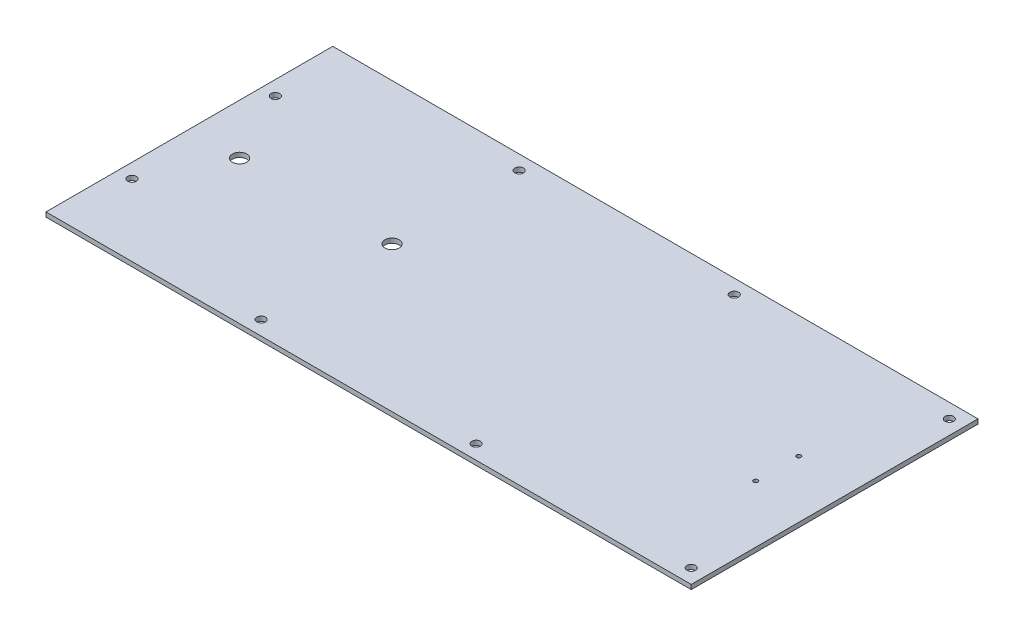
ISO-10303-21;
HEADER;
FILE_DESCRIPTION(('STEP AP214'),'2;1');
FILE_NAME('part.step','',(''),(''),'','','');
FILE_SCHEMA(('AUTOMOTIVE_DESIGN { 1 0 10303 214 1 1 1 1 }'));
ENDSEC;
DATA;
#1=APPLICATION_CONTEXT('core data for automotive mechanical design processes');
#2=APPLICATION_PROTOCOL_DEFINITION('international standard','automotive_design',2000,#1);
#3=PRODUCT_CONTEXT('',#1,'mechanical');
#4=PRODUCT('Part','Part','',(#3));
#5=PRODUCT_RELATED_PRODUCT_CATEGORY('part','',(#4));
#6=PRODUCT_DEFINITION_FORMATION('','',#4);
#7=PRODUCT_DEFINITION_CONTEXT('part definition',#1,'design');
#8=PRODUCT_DEFINITION('design','',#6,#7);
#9=PRODUCT_DEFINITION_SHAPE('','',#8);
#10=(LENGTH_UNIT() NAMED_UNIT(*) SI_UNIT(.MILLI.,.METRE.));
#11=(NAMED_UNIT(*) PLANE_ANGLE_UNIT() SI_UNIT($,.RADIAN.));
#12=(NAMED_UNIT(*) SI_UNIT($,.STERADIAN.) SOLID_ANGLE_UNIT());
#13=UNCERTAINTY_MEASURE_WITH_UNIT(LENGTH_MEASURE(1.E-05),#10,'distance_accuracy_value','');
#14=(GEOMETRIC_REPRESENTATION_CONTEXT(3) GLOBAL_UNCERTAINTY_ASSIGNED_CONTEXT((#13)) GLOBAL_UNIT_ASSIGNED_CONTEXT((#10,
#11,#12)) REPRESENTATION_CONTEXT('',''));
#15=CARTESIAN_POINT('',(0.,0.,0.));
#16=DIRECTION('',(0.,0.,1.));
#17=DIRECTION('',(1.,0.,0.));
#18=AXIS2_PLACEMENT_3D('',#15,#16,#17);
#19=CARTESIAN_POINT('',(0.,3.175,0.));
#20=DIRECTION('',(0.,-1.,0.));
#21=DIRECTION('',(0.,0.,-1.));
#22=AXIS2_PLACEMENT_3D('',#19,#20,#21);
#23=PLANE('',#22);
#24=DIRECTION('',(0.,0.,-1.));
#25=VECTOR('',#24,1.);
#26=CARTESIAN_POINT('',(450.,3.175,-110.468098834596));
#27=LINE('',#26,#25);
#28=CARTESIAN_POINT('',(450.,3.175,-110.468098834596));
#29=VERTEX_POINT('',#28);
#30=CARTESIAN_POINT('',(450.,3.175,-310.468098834596));
#31=VERTEX_POINT('',#30);
#32=EDGE_CURVE('E95',#29,#31,#27,.T.);
#33=ORIENTED_EDGE('',*,*,#32,.T.);
#34=DIRECTION('',(-1.,0.,0.));
#35=VECTOR('',#34,1.);
#36=CARTESIAN_POINT('',(70.,3.175,-310.468098834596));
#37=LINE('',#36,#35);
#38=CARTESIAN_POINT('',(0.,3.175,-310.468098834596));
#39=VERTEX_POINT('',#38);
#40=EDGE_CURVE('E89',#31,#39,#37,.T.);
#41=ORIENTED_EDGE('',*,*,#40,.T.);
#42=DIRECTION('',(0.,0.,1.));
#43=VECTOR('',#42,1.);
#44=CARTESIAN_POINT('',(0.,3.175,-310.468098834596));
#45=LINE('',#44,#43);
#46=CARTESIAN_POINT('',(0.,3.175,-110.468098834596));
#47=VERTEX_POINT('',#46);
#48=EDGE_CURVE('E92',#39,#47,#45,.T.);
#49=ORIENTED_EDGE('',*,*,#48,.T.);
#50=DIRECTION('',(1.,0.,0.));
#51=VECTOR('',#50,1.);
#52=CARTESIAN_POINT('',(70.,3.175,-110.468098834596));
#53=LINE('',#52,#51);
#54=EDGE_CURVE('E61',#47,#29,#53,.T.);
#55=ORIENTED_EDGE('',*,*,#54,.T.);
#56=EDGE_LOOP('',(#33,#41,#49,#55));
#57=FACE_BOUND('',#56,.T.);
#58=CARTESIAN_POINT('',(35.,3.175,-210.468098834596));
#59=DIRECTION('',(0.,1.,0.));
#60=DIRECTION('',(0.,0.,1.));
#61=AXIS2_PLACEMENT_3D('',#58,#59,#60);
#62=CIRCLE('',#61,5.00000000000001);
#63=CARTESIAN_POINT('',(35.,3.175,-205.468098834596));
#64=VERTEX_POINT('',#63);
#65=EDGE_CURVE('E117',#64,#64,#62,.T.);
#66=ORIENTED_EDGE('',*,*,#65,.F.);
#67=EDGE_LOOP('',(#66));
#68=FACE_BOUND('',#67,.T.);
#69=CARTESIAN_POINT('',(140.,3.175,-211.808399399269));
#70=DIRECTION('',(0.,1.,0.));
#71=DIRECTION('',(0.,0.,1.));
#72=AXIS2_PLACEMENT_3D('',#69,#70,#71);
#73=CIRCLE('',#72,4.99999999999999);
#74=CARTESIAN_POINT('',(140.,3.175,-206.808399399269));
#75=VERTEX_POINT('',#74);
#76=EDGE_CURVE('E136',#75,#75,#73,.T.);
#77=ORIENTED_EDGE('',*,*,#76,.F.);
#78=EDGE_LOOP('',(#77));
#79=FACE_BOUND('',#78,.T.);
#80=CARTESIAN_POINT('',(410.,3.175,-225.468098834596));
#81=DIRECTION('',(0.,1.,0.));
#82=DIRECTION('',(0.,0.,1.));
#83=AXIS2_PLACEMENT_3D('',#80,#81,#82);
#84=CIRCLE('',#83,1.50000000000002);
#85=CARTESIAN_POINT('',(410.,3.175,-223.968098834596));
#86=VERTEX_POINT('',#85);
#87=EDGE_CURVE('E144',#86,#86,#84,.T.);
#88=ORIENTED_EDGE('',*,*,#87,.F.);
#89=EDGE_LOOP('',(#88));
#90=FACE_BOUND('',#89,.T.);
#91=CARTESIAN_POINT('',(410.,3.175,-195.468098834596));
#92=DIRECTION('',(0.,1.,0.));
#93=DIRECTION('',(0.,0.,1.));
#94=AXIS2_PLACEMENT_3D('',#91,#92,#93);
#95=CIRCLE('',#94,1.50000000000002);
#96=CARTESIAN_POINT('',(410.,3.175,-193.968098834596));
#97=VERTEX_POINT('',#96);
#98=EDGE_CURVE('E152',#97,#97,#95,.T.);
#99=ORIENTED_EDGE('',*,*,#98,.F.);
#100=EDGE_LOOP('',(#99));
#101=FACE_BOUND('',#100,.T.);
#102=CARTESIAN_POINT('',(10.,3.175,-260.468098834596));
#103=DIRECTION('',(0.,1.,0.));
#104=DIRECTION('',(0.,0.,1.));
#105=AXIS2_PLACEMENT_3D('',#102,#103,#104);
#106=CIRCLE('',#105,3.);
#107=CARTESIAN_POINT('',(10.,3.175,-257.468098834596));
#108=VERTEX_POINT('',#107);
#109=EDGE_CURVE('E160',#108,#108,#106,.T.);
#110=ORIENTED_EDGE('',*,*,#109,.F.);
#111=EDGE_LOOP('',(#110));
#112=FACE_BOUND('',#111,.T.);
#113=CARTESIAN_POINT('',(440.,3.175,-300.468098834596));
#114=DIRECTION('',(0.,1.,0.));
#115=DIRECTION('',(0.,0.,1.));
#116=AXIS2_PLACEMENT_3D('',#113,#114,#115);
#117=CIRCLE('',#116,2.99999999999999);
#118=CARTESIAN_POINT('',(440.,3.175,-297.468098834596));
#119=VERTEX_POINT('',#118);
#120=EDGE_CURVE('E168',#119,#119,#117,.T.);
#121=ORIENTED_EDGE('',*,*,#120,.F.);
#122=EDGE_LOOP('',(#121));
#123=FACE_BOUND('',#122,.T.);
#124=CARTESIAN_POINT('',(140.,3.175,-300.468098834596));
#125=DIRECTION('',(0.,1.,0.));
#126=DIRECTION('',(0.,0.,1.));
#127=AXIS2_PLACEMENT_3D('',#124,#125,#126);
#128=CIRCLE('',#127,2.99999999999999);
#129=CARTESIAN_POINT('',(140.,3.175,-297.468098834596));
#130=VERTEX_POINT('',#129);
#131=EDGE_CURVE('E176',#130,#130,#128,.T.);
#132=ORIENTED_EDGE('',*,*,#131,.F.);
#133=EDGE_LOOP('',(#132));
#134=FACE_BOUND('',#133,.T.);
#135=CARTESIAN_POINT('',(290.,3.175,-300.468098834596));
#136=DIRECTION('',(0.,1.,0.));
#137=DIRECTION('',(0.,0.,1.));
#138=AXIS2_PLACEMENT_3D('',#135,#136,#137);
#139=CIRCLE('',#138,2.99999999999999);
#140=CARTESIAN_POINT('',(290.,3.175,-297.468098834596));
#141=VERTEX_POINT('',#140);
#142=EDGE_CURVE('E184',#141,#141,#139,.T.);
#143=ORIENTED_EDGE('',*,*,#142,.F.);
#144=EDGE_LOOP('',(#143));
#145=FACE_BOUND('',#144,.T.);
#146=CARTESIAN_POINT('',(440.,3.175,-120.468098834596));
#147=DIRECTION('',(0.,1.,0.));
#148=DIRECTION('',(0.,0.,-1.));
#149=AXIS2_PLACEMENT_3D('',#146,#147,#148);
#150=CIRCLE('',#149,2.99999999999999);
#151=CARTESIAN_POINT('',(440.,3.175,-123.468098834596));
#152=VERTEX_POINT('',#151);
#153=EDGE_CURVE('E192',#152,#152,#150,.T.);
#154=ORIENTED_EDGE('',*,*,#153,.F.);
#155=EDGE_LOOP('',(#154));
#156=FACE_BOUND('',#155,.T.);
#157=CARTESIAN_POINT('',(290.,3.175,-120.468098834596));
#158=DIRECTION('',(0.,1.,0.));
#159=DIRECTION('',(0.,0.,-1.));
#160=AXIS2_PLACEMENT_3D('',#157,#158,#159);
#161=CIRCLE('',#160,2.99999999999999);
#162=CARTESIAN_POINT('',(290.,3.175,-123.468098834596));
#163=VERTEX_POINT('',#162);
#164=EDGE_CURVE('E200',#163,#163,#161,.T.);
#165=ORIENTED_EDGE('',*,*,#164,.F.);
#166=EDGE_LOOP('',(#165));
#167=FACE_BOUND('',#166,.T.);
#168=CARTESIAN_POINT('',(140.,3.175,-120.468098834596));
#169=DIRECTION('',(0.,1.,0.));
#170=DIRECTION('',(0.,0.,-1.));
#171=AXIS2_PLACEMENT_3D('',#168,#169,#170);
#172=CIRCLE('',#171,2.99999999999999);
#173=CARTESIAN_POINT('',(140.,3.175,-123.468098834596));
#174=VERTEX_POINT('',#173);
#175=EDGE_CURVE('E208',#174,#174,#172,.T.);
#176=ORIENTED_EDGE('',*,*,#175,.F.);
#177=EDGE_LOOP('',(#176));
#178=FACE_BOUND('',#177,.T.);
#179=CARTESIAN_POINT('',(10.,3.175,-160.468098834596));
#180=DIRECTION('',(0.,1.,0.));
#181=DIRECTION('',(0.,0.,-1.));
#182=AXIS2_PLACEMENT_3D('',#179,#180,#181);
#183=CIRCLE('',#182,3.);
#184=CARTESIAN_POINT('',(10.,3.175,-163.468098834596));
#185=VERTEX_POINT('',#184);
#186=EDGE_CURVE('E216',#185,#185,#183,.T.);
#187=ORIENTED_EDGE('',*,*,#186,.F.);
#188=EDGE_LOOP('',(#187));
#189=FACE_BOUND('',#188,.T.);
#190=ADVANCED_FACE('F43',(#57,#68,#79,#90,#101,#112,#123,#134,#145,#156,#167,#178,#189),#23,.F.);
#191=CARTESIAN_POINT('',(0.,0.,0.));
#192=DIRECTION('',(0.,-1.,0.));
#193=DIRECTION('',(0.,0.,-1.));
#194=AXIS2_PLACEMENT_3D('',#191,#192,#193);
#195=PLANE('',#194);
#196=CARTESIAN_POINT('',(140.,0.,-120.468098834596));
#197=DIRECTION('',(0.,1.,0.));
#198=DIRECTION('',(0.,0.,-1.));
#199=AXIS2_PLACEMENT_3D('',#196,#197,#198);
#200=CIRCLE('',#199,2.99999999999999);
#201=CARTESIAN_POINT('',(140.,0.,-123.468098834596));
#202=VERTEX_POINT('',#201);
#203=EDGE_CURVE('E212',#202,#202,#200,.T.);
#204=ORIENTED_EDGE('',*,*,#203,.T.);
#205=EDGE_LOOP('',(#204));
#206=FACE_BOUND('',#205,.T.);
#207=CARTESIAN_POINT('',(440.,0.,-120.468098834596));
#208=DIRECTION('',(0.,1.,0.));
#209=DIRECTION('',(0.,0.,-1.));
#210=AXIS2_PLACEMENT_3D('',#207,#208,#209);
#211=CIRCLE('',#210,2.99999999999999);
#212=CARTESIAN_POINT('',(440.,0.,-123.468098834596));
#213=VERTEX_POINT('',#212);
#214=EDGE_CURVE('E196',#213,#213,#211,.T.);
#215=ORIENTED_EDGE('',*,*,#214,.T.);
#216=EDGE_LOOP('',(#215));
#217=FACE_BOUND('',#216,.T.);
#218=CARTESIAN_POINT('',(140.,0.,-300.468098834596));
#219=DIRECTION('',(0.,1.,0.));
#220=DIRECTION('',(0.,0.,1.));
#221=AXIS2_PLACEMENT_3D('',#218,#219,#220);
#222=CIRCLE('',#221,2.99999999999999);
#223=CARTESIAN_POINT('',(140.,0.,-297.468098834596));
#224=VERTEX_POINT('',#223);
#225=EDGE_CURVE('E180',#224,#224,#222,.T.);
#226=ORIENTED_EDGE('',*,*,#225,.T.);
#227=EDGE_LOOP('',(#226));
#228=FACE_BOUND('',#227,.T.);
#229=CARTESIAN_POINT('',(10.,0.,-260.468098834596));
#230=DIRECTION('',(0.,1.,0.));
#231=DIRECTION('',(0.,0.,1.));
#232=AXIS2_PLACEMENT_3D('',#229,#230,#231);
#233=CIRCLE('',#232,3.);
#234=CARTESIAN_POINT('',(10.,0.,-257.468098834596));
#235=VERTEX_POINT('',#234);
#236=EDGE_CURVE('E164',#235,#235,#233,.T.);
#237=ORIENTED_EDGE('',*,*,#236,.T.);
#238=EDGE_LOOP('',(#237));
#239=FACE_BOUND('',#238,.T.);
#240=CARTESIAN_POINT('',(410.,0.,-225.468098834596));
#241=DIRECTION('',(0.,1.,0.));
#242=DIRECTION('',(0.,0.,1.));
#243=AXIS2_PLACEMENT_3D('',#240,#241,#242);
#244=CIRCLE('',#243,1.50000000000002);
#245=CARTESIAN_POINT('',(410.,0.,-223.968098834596));
#246=VERTEX_POINT('',#245);
#247=EDGE_CURVE('E148',#246,#246,#244,.T.);
#248=ORIENTED_EDGE('',*,*,#247,.T.);
#249=EDGE_LOOP('',(#248));
#250=FACE_BOUND('',#249,.T.);
#251=CARTESIAN_POINT('',(35.,0.,-210.468098834596));
#252=DIRECTION('',(0.,1.,0.));
#253=DIRECTION('',(0.,0.,1.));
#254=AXIS2_PLACEMENT_3D('',#251,#252,#253);
#255=CIRCLE('',#254,5.00000000000001);
#256=CARTESIAN_POINT('',(35.,0.,-205.468098834596));
#257=VERTEX_POINT('',#256);
#258=EDGE_CURVE('E132',#257,#257,#255,.T.);
#259=ORIENTED_EDGE('',*,*,#258,.T.);
#260=EDGE_LOOP('',(#259));
#261=FACE_BOUND('',#260,.T.);
#262=DIRECTION('',(0.,0.,-1.));
#263=VECTOR('',#262,1.);
#264=CARTESIAN_POINT('',(450.,0.,-110.468098834596));
#265=LINE('',#264,#263);
#266=CARTESIAN_POINT('',(450.,0.,-110.468098834596));
#267=VERTEX_POINT('',#266);
#268=CARTESIAN_POINT('',(450.,0.,-310.468098834596));
#269=VERTEX_POINT('',#268);
#270=EDGE_CURVE('E113',#267,#269,#265,.T.);
#271=ORIENTED_EDGE('',*,*,#270,.F.);
#272=DIRECTION('',(1.,0.,0.));
#273=VECTOR('',#272,1.);
#274=CARTESIAN_POINT('',(70.,0.,-110.468098834596));
#275=LINE('',#274,#273);
#276=CARTESIAN_POINT('',(0.,0.,-110.468098834596));
#277=VERTEX_POINT('',#276);
#278=EDGE_CURVE('E78',#277,#267,#275,.T.);
#279=ORIENTED_EDGE('',*,*,#278,.F.);
#280=DIRECTION('',(0.,0.,1.));
#281=VECTOR('',#280,1.);
#282=CARTESIAN_POINT('',(0.,0.,-310.468098834596));
#283=LINE('',#282,#281);
#284=CARTESIAN_POINT('',(0.,0.,-310.468098834596));
#285=VERTEX_POINT('',#284);
#286=EDGE_CURVE('E120',#285,#277,#283,.T.);
#287=ORIENTED_EDGE('',*,*,#286,.F.);
#288=DIRECTION('',(-1.,0.,0.));
#289=VECTOR('',#288,1.);
#290=CARTESIAN_POINT('',(0.,0.,-310.468098834596));
#291=LINE('',#290,#289);
#292=EDGE_CURVE('E101',#269,#285,#291,.T.);
#293=ORIENTED_EDGE('',*,*,#292,.F.);
#294=EDGE_LOOP('',(#271,#279,#287,#293));
#295=FACE_BOUND('',#294,.T.);
#296=CARTESIAN_POINT('',(140.,0.,-211.808399399269));
#297=DIRECTION('',(0.,1.,0.));
#298=DIRECTION('',(0.,0.,1.));
#299=AXIS2_PLACEMENT_3D('',#296,#297,#298);
#300=CIRCLE('',#299,4.99999999999999);
#301=CARTESIAN_POINT('',(140.,0.,-206.808399399269));
#302=VERTEX_POINT('',#301);
#303=EDGE_CURVE('E140',#302,#302,#300,.T.);
#304=ORIENTED_EDGE('',*,*,#303,.T.);
#305=EDGE_LOOP('',(#304));
#306=FACE_BOUND('',#305,.T.);
#307=CARTESIAN_POINT('',(410.,0.,-195.468098834596));
#308=DIRECTION('',(0.,1.,0.));
#309=DIRECTION('',(0.,0.,1.));
#310=AXIS2_PLACEMENT_3D('',#307,#308,#309);
#311=CIRCLE('',#310,1.50000000000002);
#312=CARTESIAN_POINT('',(410.,0.,-193.968098834596));
#313=VERTEX_POINT('',#312);
#314=EDGE_CURVE('E156',#313,#313,#311,.T.);
#315=ORIENTED_EDGE('',*,*,#314,.T.);
#316=EDGE_LOOP('',(#315));
#317=FACE_BOUND('',#316,.T.);
#318=CARTESIAN_POINT('',(440.,0.,-300.468098834596));
#319=DIRECTION('',(0.,1.,0.));
#320=DIRECTION('',(0.,0.,1.));
#321=AXIS2_PLACEMENT_3D('',#318,#319,#320);
#322=CIRCLE('',#321,2.99999999999999);
#323=CARTESIAN_POINT('',(440.,0.,-297.468098834596));
#324=VERTEX_POINT('',#323);
#325=EDGE_CURVE('E172',#324,#324,#322,.T.);
#326=ORIENTED_EDGE('',*,*,#325,.T.);
#327=EDGE_LOOP('',(#326));
#328=FACE_BOUND('',#327,.T.);
#329=CARTESIAN_POINT('',(290.,0.,-300.468098834596));
#330=DIRECTION('',(0.,1.,0.));
#331=DIRECTION('',(0.,0.,1.));
#332=AXIS2_PLACEMENT_3D('',#329,#330,#331);
#333=CIRCLE('',#332,2.99999999999999);
#334=CARTESIAN_POINT('',(290.,0.,-297.468098834596));
#335=VERTEX_POINT('',#334);
#336=EDGE_CURVE('E188',#335,#335,#333,.T.);
#337=ORIENTED_EDGE('',*,*,#336,.T.);
#338=EDGE_LOOP('',(#337));
#339=FACE_BOUND('',#338,.T.);
#340=CARTESIAN_POINT('',(290.,0.,-120.468098834596));
#341=DIRECTION('',(0.,1.,0.));
#342=DIRECTION('',(0.,0.,-1.));
#343=AXIS2_PLACEMENT_3D('',#340,#341,#342);
#344=CIRCLE('',#343,2.99999999999999);
#345=CARTESIAN_POINT('',(290.,0.,-123.468098834596));
#346=VERTEX_POINT('',#345);
#347=EDGE_CURVE('E204',#346,#346,#344,.T.);
#348=ORIENTED_EDGE('',*,*,#347,.T.);
#349=EDGE_LOOP('',(#348));
#350=FACE_BOUND('',#349,.T.);
#351=CARTESIAN_POINT('',(10.,0.,-160.468098834596));
#352=DIRECTION('',(0.,1.,0.));
#353=DIRECTION('',(0.,0.,-1.));
#354=AXIS2_PLACEMENT_3D('',#351,#352,#353);
#355=CIRCLE('',#354,3.);
#356=CARTESIAN_POINT('',(10.,0.,-163.468098834596));
#357=VERTEX_POINT('',#356);
#358=EDGE_CURVE('E220',#357,#357,#355,.T.);
#359=ORIENTED_EDGE('',*,*,#358,.T.);
#360=EDGE_LOOP('',(#359));
#361=FACE_BOUND('',#360,.T.);
#362=ADVANCED_FACE('F232',(#206,#217,#228,#239,#250,#261,#295,#306,#317,#328,#339,#350,#361),
#195,.T.);
#363=CARTESIAN_POINT('',(450.,3.175,-110.468098834596));
#364=DIRECTION('',(-1.,0.,0.));
#365=DIRECTION('',(0.,0.,1.));
#366=AXIS2_PLACEMENT_3D('',#363,#364,#365);
#367=PLANE('',#366);
#368=ORIENTED_EDGE('',*,*,#270,.T.);
#369=DIRECTION('',(0.,-1.,0.));
#370=VECTOR('',#369,1.);
#371=CARTESIAN_POINT('',(450.,3.175,-310.468098834596));
#372=LINE('',#371,#370);
#373=EDGE_CURVE('E11',#31,#269,#372,.T.);
#374=ORIENTED_EDGE('',*,*,#373,.F.);
#375=ORIENTED_EDGE('',*,*,#32,.F.);
#376=DIRECTION('',(0.,-1.,0.));
#377=VECTOR('',#376,1.);
#378=CARTESIAN_POINT('',(450.,3.175,-110.468098834596));
#379=LINE('',#378,#377);
#380=EDGE_CURVE('E109',#29,#267,#379,.T.);
#381=ORIENTED_EDGE('',*,*,#380,.T.);
#382=EDGE_LOOP('',(#368,#374,#375,#381));
#383=FACE_BOUND('',#382,.T.);
#384=ADVANCED_FACE('F45',(#383),#367,.F.);
#385=CARTESIAN_POINT('',(0.,3.175,-310.468098834596));
#386=DIRECTION('',(0.,0.,1.));
#387=DIRECTION('',(1.,0.,0.));
#388=AXIS2_PLACEMENT_3D('',#385,#386,#387);
#389=PLANE('',#388);
#390=ORIENTED_EDGE('',*,*,#292,.T.);
#391=DIRECTION('',(0.,-1.,0.));
#392=VECTOR('',#391,1.);
#393=CARTESIAN_POINT('',(0.,3.175,-310.468098834596));
#394=LINE('',#393,#392);
#395=EDGE_CURVE('E53',#39,#285,#394,.T.);
#396=ORIENTED_EDGE('',*,*,#395,.F.);
#397=ORIENTED_EDGE('',*,*,#40,.F.);
#398=ORIENTED_EDGE('',*,*,#373,.T.);
#399=EDGE_LOOP('',(#390,#396,#397,#398));
#400=FACE_BOUND('',#399,.T.);
#401=ADVANCED_FACE('F100',(#400),#389,.F.);
#402=CARTESIAN_POINT('',(0.,3.175,-310.468098834596));
#403=DIRECTION('',(1.,0.,0.));
#404=DIRECTION('',(0.,0.,-1.));
#405=AXIS2_PLACEMENT_3D('',#402,#403,#404);
#406=PLANE('',#405);
#407=ORIENTED_EDGE('',*,*,#286,.T.);
#408=DIRECTION('',(0.,-1.,0.));
#409=VECTOR('',#408,1.);
#410=CARTESIAN_POINT('',(0.,3.175,-110.468098834596));
#411=LINE('',#410,#409);
#412=EDGE_CURVE('E104',#47,#277,#411,.T.);
#413=ORIENTED_EDGE('',*,*,#412,.F.);
#414=ORIENTED_EDGE('',*,*,#48,.F.);
#415=ORIENTED_EDGE('',*,*,#395,.T.);
#416=EDGE_LOOP('',(#407,#413,#414,#415));
#417=FACE_BOUND('',#416,.T.);
#418=ADVANCED_FACE('F105',(#417),#406,.F.);
#419=CARTESIAN_POINT('',(70.,3.175,-110.468098834596));
#420=DIRECTION('',(0.,0.,-1.));
#421=DIRECTION('',(-1.,0.,0.));
#422=AXIS2_PLACEMENT_3D('',#419,#420,#421);
#423=PLANE('',#422);
#424=ORIENTED_EDGE('',*,*,#278,.T.);
#425=ORIENTED_EDGE('',*,*,#380,.F.);
#426=ORIENTED_EDGE('',*,*,#54,.F.);
#427=ORIENTED_EDGE('',*,*,#412,.T.);
#428=EDGE_LOOP('',(#424,#425,#426,#427));
#429=FACE_BOUND('',#428,.T.);
#430=ADVANCED_FACE('F128',(#429),#423,.F.);
#431=CARTESIAN_POINT('',(35.,3.175,-210.468098834596));
#432=DIRECTION('',(0.,-1.,0.));
#433=DIRECTION('',(0.,0.,-1.));
#434=AXIS2_PLACEMENT_3D('',#431,#432,#433);
#435=CYLINDRICAL_SURFACE('',#434,5.00000000000001);
#436=ORIENTED_EDGE('',*,*,#65,.T.);
#437=EDGE_LOOP('',(#436));
#438=FACE_BOUND('',#437,.T.);
#439=ORIENTED_EDGE('',*,*,#258,.F.);
#440=EDGE_LOOP('',(#439));
#441=FACE_BOUND('',#440,.T.);
#442=ADVANCED_FACE('F240',(#438,#441),#435,.F.);
#443=CARTESIAN_POINT('',(140.,3.175,-211.808399399269));
#444=DIRECTION('',(0.,-1.,0.));
#445=DIRECTION('',(0.,0.,-1.));
#446=AXIS2_PLACEMENT_3D('',#443,#444,#445);
#447=CYLINDRICAL_SURFACE('',#446,4.99999999999999);
#448=ORIENTED_EDGE('',*,*,#76,.T.);
#449=EDGE_LOOP('',(#448));
#450=FACE_BOUND('',#449,.T.);
#451=ORIENTED_EDGE('',*,*,#303,.F.);
#452=EDGE_LOOP('',(#451));
#453=FACE_BOUND('',#452,.T.);
#454=ADVANCED_FACE('F295',(#450,#453),#447,.F.);
#455=CARTESIAN_POINT('',(410.,3.175,-225.468098834596));
#456=DIRECTION('',(0.,-1.,0.));
#457=DIRECTION('',(0.,0.,-1.));
#458=AXIS2_PLACEMENT_3D('',#455,#456,#457);
#459=CYLINDRICAL_SURFACE('',#458,1.50000000000002);
#460=ORIENTED_EDGE('',*,*,#87,.T.);
#461=EDGE_LOOP('',(#460));
#462=FACE_BOUND('',#461,.T.);
#463=ORIENTED_EDGE('',*,*,#247,.F.);
#464=EDGE_LOOP('',(#463));
#465=FACE_BOUND('',#464,.T.);
#466=ADVANCED_FACE('F304',(#462,#465),#459,.F.);
#467=CARTESIAN_POINT('',(410.,3.175,-195.468098834596));
#468=DIRECTION('',(0.,-1.,0.));
#469=DIRECTION('',(0.,0.,-1.));
#470=AXIS2_PLACEMENT_3D('',#467,#468,#469);
#471=CYLINDRICAL_SURFACE('',#470,1.50000000000002);
#472=ORIENTED_EDGE('',*,*,#98,.T.);
#473=EDGE_LOOP('',(#472));
#474=FACE_BOUND('',#473,.T.);
#475=ORIENTED_EDGE('',*,*,#314,.F.);
#476=EDGE_LOOP('',(#475));
#477=FACE_BOUND('',#476,.T.);
#478=ADVANCED_FACE('F313',(#474,#477),#471,.F.);
#479=CARTESIAN_POINT('',(10.,3.175,-260.468098834596));
#480=DIRECTION('',(0.,-1.,0.));
#481=DIRECTION('',(0.,0.,-1.));
#482=AXIS2_PLACEMENT_3D('',#479,#480,#481);
#483=CYLINDRICAL_SURFACE('',#482,3.);
#484=ORIENTED_EDGE('',*,*,#109,.T.);
#485=EDGE_LOOP('',(#484));
#486=FACE_BOUND('',#485,.T.);
#487=ORIENTED_EDGE('',*,*,#236,.F.);
#488=EDGE_LOOP('',(#487));
#489=FACE_BOUND('',#488,.T.);
#490=ADVANCED_FACE('F323',(#486,#489),#483,.F.);
#491=CARTESIAN_POINT('',(440.,3.175,-300.468098834596));
#492=DIRECTION('',(0.,-1.,0.));
#493=DIRECTION('',(0.,0.,-1.));
#494=AXIS2_PLACEMENT_3D('',#491,#492,#493);
#495=CYLINDRICAL_SURFACE('',#494,2.99999999999999);
#496=ORIENTED_EDGE('',*,*,#120,.T.);
#497=EDGE_LOOP('',(#496));
#498=FACE_BOUND('',#497,.T.);
#499=ORIENTED_EDGE('',*,*,#325,.F.);
#500=EDGE_LOOP('',(#499));
#501=FACE_BOUND('',#500,.T.);
#502=ADVANCED_FACE('F333',(#498,#501),#495,.F.);
#503=CARTESIAN_POINT('',(140.,3.175,-300.468098834596));
#504=DIRECTION('',(0.,-1.,0.));
#505=DIRECTION('',(0.,0.,-1.));
#506=AXIS2_PLACEMENT_3D('',#503,#504,#505);
#507=CYLINDRICAL_SURFACE('',#506,2.99999999999999);
#508=ORIENTED_EDGE('',*,*,#131,.T.);
#509=EDGE_LOOP('',(#508));
#510=FACE_BOUND('',#509,.T.);
#511=ORIENTED_EDGE('',*,*,#225,.F.);
#512=EDGE_LOOP('',(#511));
#513=FACE_BOUND('',#512,.T.);
#514=ADVANCED_FACE('F343',(#510,#513),#507,.F.);
#515=CARTESIAN_POINT('',(290.,3.175,-300.468098834596));
#516=DIRECTION('',(0.,-1.,0.));
#517=DIRECTION('',(0.,0.,-1.));
#518=AXIS2_PLACEMENT_3D('',#515,#516,#517);
#519=CYLINDRICAL_SURFACE('',#518,2.99999999999999);
#520=ORIENTED_EDGE('',*,*,#142,.T.);
#521=EDGE_LOOP('',(#520));
#522=FACE_BOUND('',#521,.T.);
#523=ORIENTED_EDGE('',*,*,#336,.F.);
#524=EDGE_LOOP('',(#523));
#525=FACE_BOUND('',#524,.T.);
#526=ADVANCED_FACE('F353',(#522,#525),#519,.F.);
#527=CARTESIAN_POINT('',(440.,3.175,-120.468098834596));
#528=DIRECTION('',(0.,-1.,0.));
#529=DIRECTION('',(0.,0.,-1.));
#530=AXIS2_PLACEMENT_3D('',#527,#528,#529);
#531=CYLINDRICAL_SURFACE('',#530,2.99999999999999);
#532=ORIENTED_EDGE('',*,*,#153,.T.);
#533=EDGE_LOOP('',(#532));
#534=FACE_BOUND('',#533,.T.);
#535=ORIENTED_EDGE('',*,*,#214,.F.);
#536=EDGE_LOOP('',(#535));
#537=FACE_BOUND('',#536,.T.);
#538=ADVANCED_FACE('F363',(#534,#537),#531,.F.);
#539=CARTESIAN_POINT('',(290.,3.175,-120.468098834596));
#540=DIRECTION('',(0.,-1.,0.));
#541=DIRECTION('',(0.,0.,-1.));
#542=AXIS2_PLACEMENT_3D('',#539,#540,#541);
#543=CYLINDRICAL_SURFACE('',#542,2.99999999999999);
#544=ORIENTED_EDGE('',*,*,#164,.T.);
#545=EDGE_LOOP('',(#544));
#546=FACE_BOUND('',#545,.T.);
#547=ORIENTED_EDGE('',*,*,#347,.F.);
#548=EDGE_LOOP('',(#547));
#549=FACE_BOUND('',#548,.T.);
#550=ADVANCED_FACE('F373',(#546,#549),#543,.F.);
#551=CARTESIAN_POINT('',(140.,3.175,-120.468098834596));
#552=DIRECTION('',(0.,-1.,0.));
#553=DIRECTION('',(0.,0.,-1.));
#554=AXIS2_PLACEMENT_3D('',#551,#552,#553);
#555=CYLINDRICAL_SURFACE('',#554,2.99999999999999);
#556=ORIENTED_EDGE('',*,*,#175,.T.);
#557=EDGE_LOOP('',(#556));
#558=FACE_BOUND('',#557,.T.);
#559=ORIENTED_EDGE('',*,*,#203,.F.);
#560=EDGE_LOOP('',(#559));
#561=FACE_BOUND('',#560,.T.);
#562=ADVANCED_FACE('F383',(#558,#561),#555,.F.);
#563=CARTESIAN_POINT('',(10.,3.175,-160.468098834596));
#564=DIRECTION('',(0.,-1.,0.));
#565=DIRECTION('',(0.,0.,-1.));
#566=AXIS2_PLACEMENT_3D('',#563,#564,#565);
#567=CYLINDRICAL_SURFACE('',#566,3.);
#568=ORIENTED_EDGE('',*,*,#186,.T.);
#569=EDGE_LOOP('',(#568));
#570=FACE_BOUND('',#569,.T.);
#571=ORIENTED_EDGE('',*,*,#358,.F.);
#572=EDGE_LOOP('',(#571));
#573=FACE_BOUND('',#572,.T.);
#574=ADVANCED_FACE('F228',(#570,#573),#567,.F.);
#575=CLOSED_SHELL('',(#190,#362,#384,#401,#418,#430,#442,#454,#466,#478,#490,#502,#514,#526,
#538,#550,#562,#574));
#576=MANIFOLD_SOLID_BREP('B2',#575);
#577=ADVANCED_BREP_SHAPE_REPRESENTATION('',(#18,#576),#14);
#578=SHAPE_DEFINITION_REPRESENTATION(#9,#577);
ENDSEC;
END-ISO-10303-21;
